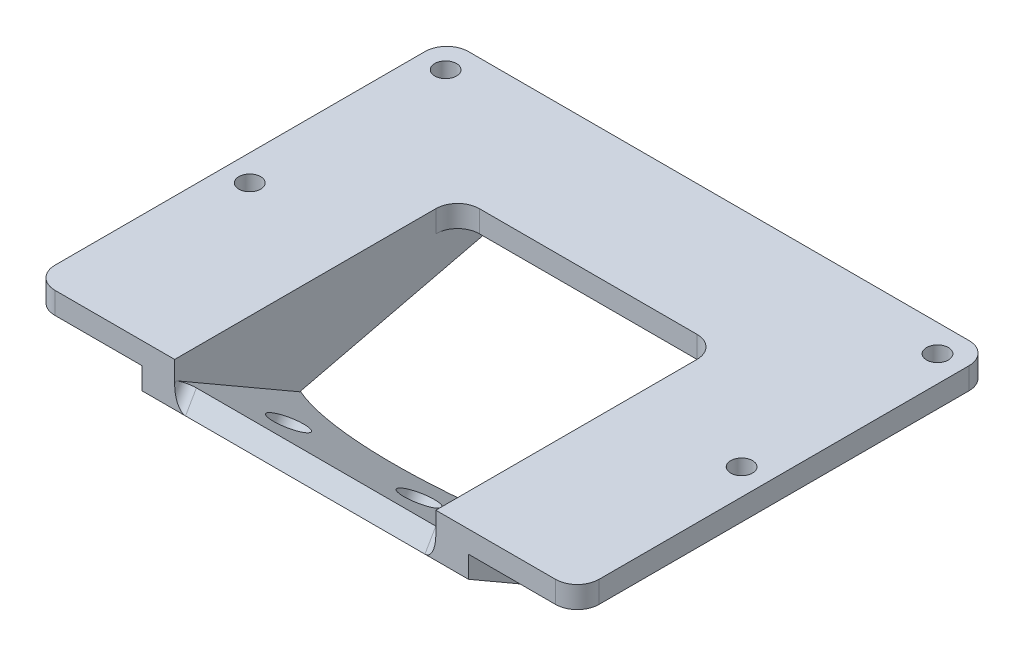
ISO-10303-21;
HEADER;
FILE_DESCRIPTION(('STEP AP214'),'2;1');
FILE_NAME('part.step','',(''),(''),'','','');
FILE_SCHEMA(('AUTOMOTIVE_DESIGN { 1 0 10303 214 1 1 1 1 }'));
ENDSEC;
DATA;
#1=APPLICATION_CONTEXT('core data for automotive mechanical design processes');
#2=APPLICATION_PROTOCOL_DEFINITION('international standard','automotive_design',2000,#1);
#3=PRODUCT_CONTEXT('',#1,'mechanical');
#4=PRODUCT('Part','Part','',(#3));
#5=PRODUCT_RELATED_PRODUCT_CATEGORY('part','',(#4));
#6=PRODUCT_DEFINITION_FORMATION('','',#4);
#7=PRODUCT_DEFINITION_CONTEXT('part definition',#1,'design');
#8=PRODUCT_DEFINITION('design','',#6,#7);
#9=PRODUCT_DEFINITION_SHAPE('','',#8);
#10=(LENGTH_UNIT() NAMED_UNIT(*) SI_UNIT(.MILLI.,.METRE.));
#11=(NAMED_UNIT(*) PLANE_ANGLE_UNIT() SI_UNIT($,.RADIAN.));
#12=(NAMED_UNIT(*) SI_UNIT($,.STERADIAN.) SOLID_ANGLE_UNIT());
#13=UNCERTAINTY_MEASURE_WITH_UNIT(LENGTH_MEASURE(1.E-05),#10,'distance_accuracy_value','');
#14=(GEOMETRIC_REPRESENTATION_CONTEXT(3) GLOBAL_UNCERTAINTY_ASSIGNED_CONTEXT((#13)) GLOBAL_UNIT_ASSIGNED_CONTEXT((#10,
#11,#12)) REPRESENTATION_CONTEXT('',''));
#15=CARTESIAN_POINT('',(0.,0.,0.));
#16=DIRECTION('',(0.,0.,1.));
#17=DIRECTION('',(1.,0.,0.));
#18=AXIS2_PLACEMENT_3D('',#15,#16,#17);
#19=CARTESIAN_POINT('',(15.,-7.00000000000001,10.3397459621556));
#20=DIRECTION('',(0.,0.972698943244275,0.232070605229251));
#21=DIRECTION('',(0.,-0.232070605229251,0.972698943244275));
#22=AXIS2_PLACEMENT_3D('',#19,#20,#21);
#23=PLANE('',#22);
#24=DIRECTION('',(1.,0.,0.));
#25=VECTOR('',#24,1.);
#26=CARTESIAN_POINT('',(15.,-6.32471707068706,7.50937030520959));
#27=LINE('',#26,#25);
#28=CARTESIAN_POINT('',(12.,-6.32471707068706,7.5093703052096));
#29=VERTEX_POINT('',#28);
#30=CARTESIAN_POINT('',(15.,-6.32471707068706,7.50937030520959));
#31=VERTEX_POINT('',#30);
#32=EDGE_CURVE('E207',#29,#31,#27,.T.);
#33=ORIENTED_EDGE('',*,*,#32,.F.);
#34=DIRECTION('',(0.,0.232070605229251,-0.972698943244275));
#35=VECTOR('',#34,1.);
#36=CARTESIAN_POINT('',(12.,-7.00000000000001,10.3397459621556));
#37=LINE('',#36,#35);
#38=CARTESIAN_POINT('',(12.,0.,-19.));
#39=VERTEX_POINT('',#38);
#40=EDGE_CURVE('E259',#29,#39,#37,.T.);
#41=ORIENTED_EDGE('',*,*,#40,.T.);
#42=DIRECTION('',(-1.,0.,0.));
#43=VECTOR('',#42,1.);
#44=CARTESIAN_POINT('',(15.,0.,-19.));
#45=LINE('',#44,#43);
#46=CARTESIAN_POINT('',(15.,0.,-19.));
#47=VERTEX_POINT('',#46);
#48=EDGE_CURVE('E257',#47,#39,#45,.T.);
#49=ORIENTED_EDGE('',*,*,#48,.F.);
#50=DIRECTION('',(0.,0.232070605229251,-0.972698943244275));
#51=VECTOR('',#50,1.);
#52=CARTESIAN_POINT('',(15.,-7.00000000000001,10.3397459621556));
#53=LINE('',#52,#51);
#54=EDGE_CURVE('E251',#31,#47,#53,.T.);
#55=ORIENTED_EDGE('',*,*,#54,.F.);
#56=EDGE_LOOP('',(#33,#41,#49,#55));
#57=FACE_BOUND('',#56,.T.);
#58=ADVANCED_FACE('F43',(#57),#23,.F.);
#59=CARTESIAN_POINT('',(-15.,-7.00000000000001,10.3397459621556));
#60=DIRECTION('',(0.,-0.972698943244275,-0.232070605229251));
#61=DIRECTION('',(0.,0.232070605229251,-0.972698943244275));
#62=AXIS2_PLACEMENT_3D('',#59,#60,#61);
#63=PLANE('',#62);
#64=DIRECTION('',(0.,0.232070605229251,-0.972698943244275));
#65=VECTOR('',#64,1.);
#66=CARTESIAN_POINT('',(-12.,-7.00000000000001,10.3397459621556));
#67=LINE('',#66,#65);
#68=CARTESIAN_POINT('',(-12.,-6.32471707068706,7.5093703052096));
#69=VERTEX_POINT('',#68);
#70=CARTESIAN_POINT('',(-12.,0.,-19.));
#71=VERTEX_POINT('',#70);
#72=EDGE_CURVE('E226',#69,#71,#67,.T.);
#73=ORIENTED_EDGE('',*,*,#72,.F.);
#74=DIRECTION('',(-1.,0.,0.));
#75=VECTOR('',#74,1.);
#76=CARTESIAN_POINT('',(-15.,-6.32471707068706,7.50937030520959));
#77=LINE('',#76,#75);
#78=CARTESIAN_POINT('',(-15.,-6.32471707068706,7.5093703052096));
#79=VERTEX_POINT('',#78);
#80=EDGE_CURVE('E200',#69,#79,#77,.T.);
#81=ORIENTED_EDGE('',*,*,#80,.T.);
#82=DIRECTION('',(0.,0.232070605229251,-0.972698943244275));
#83=VECTOR('',#82,1.);
#84=CARTESIAN_POINT('',(-15.,-7.00000000000001,10.3397459621556));
#85=LINE('',#84,#83);
#86=CARTESIAN_POINT('',(-15.,0.,-19.));
#87=VERTEX_POINT('',#86);
#88=EDGE_CURVE('E229',#79,#87,#85,.T.);
#89=ORIENTED_EDGE('',*,*,#88,.T.);
#90=DIRECTION('',(1.,0.,0.));
#91=VECTOR('',#90,1.);
#92=CARTESIAN_POINT('',(-15.,0.,-19.));
#93=LINE('',#92,#91);
#94=EDGE_CURVE('E242',#87,#71,#93,.T.);
#95=ORIENTED_EDGE('',*,*,#94,.T.);
#96=EDGE_LOOP('',(#73,#81,#89,#95));
#97=FACE_BOUND('',#96,.T.);
#98=ADVANCED_FACE('F491',(#97),#63,.T.);
#99=CARTESIAN_POINT('',(-25.,2.,19.));
#100=DIRECTION('',(0.,0.,-1.));
#101=DIRECTION('',(-1.,0.,0.));
#102=AXIS2_PLACEMENT_3D('',#99,#100,#101);
#103=PLANE('',#102);
#104=DIRECTION('',(1.,0.,0.));
#105=VECTOR('',#104,1.);
#106=CARTESIAN_POINT('',(-25.,2.,19.));
#107=LINE('',#106,#105);
#108=CARTESIAN_POINT('',(-23.,2.,19.));
#109=VERTEX_POINT('',#108);
#110=CARTESIAN_POINT('',(-12.,2.,19.));
#111=VERTEX_POINT('',#110);
#112=EDGE_CURVE('E303',#109,#111,#107,.T.);
#113=ORIENTED_EDGE('',*,*,#112,.F.);
#114=DIRECTION('',(0.,-1.,0.));
#115=VECTOR('',#114,1.);
#116=CARTESIAN_POINT('',(-23.,2.,19.));
#117=LINE('',#116,#115);
#118=CARTESIAN_POINT('',(-23.,0.,19.));
#119=VERTEX_POINT('',#118);
#120=EDGE_CURVE('E364',#109,#119,#117,.T.);
#121=ORIENTED_EDGE('',*,*,#120,.T.);
#122=DIRECTION('',(1.,0.,0.));
#123=VECTOR('',#122,1.);
#124=CARTESIAN_POINT('',(-25.,0.,19.));
#125=LINE('',#124,#123);
#126=CARTESIAN_POINT('',(-15.,0.,19.));
#127=VERTEX_POINT('',#126);
#128=EDGE_CURVE('E296',#119,#127,#125,.T.);
#129=ORIENTED_EDGE('',*,*,#128,.T.);
#130=DIRECTION('',(0.,-1.,0.));
#131=VECTOR('',#130,1.);
#132=CARTESIAN_POINT('',(-15.,0.,19.));
#133=LINE('',#132,#131);
#134=CARTESIAN_POINT('',(-15.,-2.,19.));
#135=VERTEX_POINT('',#134);
#136=EDGE_CURVE('E223',#127,#135,#133,.T.);
#137=ORIENTED_EDGE('',*,*,#136,.T.);
#138=DIRECTION('',(1.,0.,0.));
#139=VECTOR('',#138,1.);
#140=CARTESIAN_POINT('',(-15.,-2.,19.));
#141=LINE('',#140,#139);
#142=CARTESIAN_POINT('',(-11.,-2.,19.));
#143=VERTEX_POINT('',#142);
#144=EDGE_CURVE('E81',#135,#143,#141,.T.);
#145=ORIENTED_EDGE('',*,*,#144,.T.);
#146=CARTESIAN_POINT('',(-11.,0.,19.));
#147=DIRECTION('',(0.,0.,-1.));
#148=DIRECTION('',(0.,1.,0.));
#149=AXIS2_PLACEMENT_3D('',#146,#147,#148);
#150=ELLIPSE('',#149,2.,1.);
#151=CARTESIAN_POINT('',(-12.,0.,19.));
#152=VERTEX_POINT('',#151);
#153=EDGE_CURVE('E150',#143,#152,#150,.T.);
#154=ORIENTED_EDGE('',*,*,#153,.T.);
#155=DIRECTION('',(0.,-1.,0.));
#156=VECTOR('',#155,1.);
#157=CARTESIAN_POINT('',(-12.,0.,19.));
#158=LINE('',#157,#156);
#159=EDGE_CURVE('E222',#111,#152,#158,.T.);
#160=ORIENTED_EDGE('',*,*,#159,.F.);
#161=EDGE_LOOP('',(#113,#121,#129,#137,#145,#154,#160));
#162=FACE_BOUND('',#161,.T.);
#163=ADVANCED_FACE('F408',(#162),#103,.F.);
#164=CARTESIAN_POINT('',(0.,0.,0.));
#165=DIRECTION('',(0.,-1.,0.));
#166=DIRECTION('',(0.,0.,-1.));
#167=AXIS2_PLACEMENT_3D('',#164,#165,#166);
#168=PLANE('',#167);
#169=DIRECTION('',(1.,0.,0.));
#170=VECTOR('',#169,1.);
#171=CARTESIAN_POINT('',(0.,0.,-7.));
#172=LINE('',#171,#170);
#173=CARTESIAN_POINT('',(-10.,0.,-7.));
#174=VERTEX_POINT('',#173);
#175=CARTESIAN_POINT('',(10.,0.,-7.));
#176=VERTEX_POINT('',#175);
#177=EDGE_CURVE('E219',#174,#176,#172,.T.);
#178=ORIENTED_EDGE('',*,*,#177,.F.);
#179=CARTESIAN_POINT('',(-10.,0.,-5.));
#180=DIRECTION('',(0.,-1.,0.));
#181=DIRECTION('',(0.,0.,-1.));
#182=AXIS2_PLACEMENT_3D('',#179,#180,#181);
#183=CIRCLE('',#182,2.);
#184=CARTESIAN_POINT('',(-12.,0.,-5.));
#185=VERTEX_POINT('',#184);
#186=EDGE_CURVE('E382',#174,#185,#183,.F.);
#187=ORIENTED_EDGE('',*,*,#186,.T.);
#188=DIRECTION('',(0.,0.,1.));
#189=VECTOR('',#188,1.);
#190=CARTESIAN_POINT('',(-12.,0.,19.));
#191=LINE('',#190,#189);
#192=EDGE_CURVE('E236',#71,#185,#191,.T.);
#193=ORIENTED_EDGE('',*,*,#192,.F.);
#194=DIRECTION('',(-1.,0.,0.));
#195=VECTOR('',#194,1.);
#196=CARTESIAN_POINT('',(-25.,0.,-19.));
#197=LINE('',#196,#195);
#198=EDGE_CURVE('E314',#39,#71,#197,.T.);
#199=ORIENTED_EDGE('',*,*,#198,.F.);
#200=DIRECTION('',(0.,0.,1.));
#201=VECTOR('',#200,1.);
#202=CARTESIAN_POINT('',(12.,0.,19.));
#203=LINE('',#202,#201);
#204=CARTESIAN_POINT('',(12.,0.,-5.));
#205=VERTEX_POINT('',#204);
#206=EDGE_CURVE('E249',#39,#205,#203,.T.);
#207=ORIENTED_EDGE('',*,*,#206,.T.);
#208=CARTESIAN_POINT('',(10.,0.,-5.));
#209=DIRECTION('',(0.,-1.,0.));
#210=DIRECTION('',(0.,0.,-1.));
#211=AXIS2_PLACEMENT_3D('',#208,#209,#210);
#212=CIRCLE('',#211,2.);
#213=EDGE_CURVE('E388',#205,#176,#212,.F.);
#214=ORIENTED_EDGE('',*,*,#213,.T.);
#215=EDGE_LOOP('',(#178,#187,#193,#199,#207,#214));
#216=FACE_BOUND('',#215,.T.);
#217=ADVANCED_FACE('F514',(#216),#168,.T.);
#218=DIRECTION('',(0.,0.,1.));
#219=VECTOR('',#218,1.);
#220=CARTESIAN_POINT('',(-25.,0.,19.));
#221=LINE('',#220,#219);
#222=CARTESIAN_POINT('',(-25.,0.,-17.));
#223=VERTEX_POINT('',#222);
#224=CARTESIAN_POINT('',(-25.,0.,17.));
#225=VERTEX_POINT('',#224);
#226=EDGE_CURVE('E313',#223,#225,#221,.T.);
#227=ORIENTED_EDGE('',*,*,#226,.F.);
#228=CARTESIAN_POINT('',(-23.,0.,-17.));
#229=DIRECTION('',(0.,-1.,0.));
#230=DIRECTION('',(0.,0.,-1.));
#231=AXIS2_PLACEMENT_3D('',#228,#229,#230);
#232=CIRCLE('',#231,2.);
#233=CARTESIAN_POINT('',(-23.,0.,-19.));
#234=VERTEX_POINT('',#233);
#235=EDGE_CURVE('E361',#223,#234,#232,.T.);
#236=ORIENTED_EDGE('',*,*,#235,.T.);
#237=EDGE_CURVE('E309',#87,#234,#197,.T.);
#238=ORIENTED_EDGE('',*,*,#237,.F.);
#239=DIRECTION('',(0.,0.,1.));
#240=VECTOR('',#239,1.);
#241=CARTESIAN_POINT('',(-15.,0.,19.));
#242=LINE('',#241,#240);
#243=EDGE_CURVE('E225',#87,#127,#242,.T.);
#244=ORIENTED_EDGE('',*,*,#243,.T.);
#245=ORIENTED_EDGE('',*,*,#128,.F.);
#246=CARTESIAN_POINT('',(-23.,0.,17.));
#247=DIRECTION('',(0.,-1.,0.));
#248=DIRECTION('',(0.,0.,-1.));
#249=AXIS2_PLACEMENT_3D('',#246,#247,#248);
#250=CIRCLE('',#249,2.);
#251=EDGE_CURVE('E358',#119,#225,#250,.T.);
#252=ORIENTED_EDGE('',*,*,#251,.T.);
#253=EDGE_LOOP('',(#227,#236,#238,#244,#245,#252));
#254=FACE_BOUND('',#253,.T.);
#255=CARTESIAN_POINT('',(-22.6,0.,1.49999999999999));
#256=DIRECTION('',(0.,1.,0.));
#257=DIRECTION('',(0.,0.,1.));
#258=AXIS2_PLACEMENT_3D('',#255,#256,#257);
#259=CIRCLE('',#258,1.);
#260=CARTESIAN_POINT('',(-22.6,0.,2.5));
#261=VERTEX_POINT('',#260);
#262=EDGE_CURVE('E277',#261,#261,#259,.T.);
#263=ORIENTED_EDGE('',*,*,#262,.T.);
#264=EDGE_LOOP('',(#263));
#265=FACE_BOUND('',#264,.T.);
#266=CARTESIAN_POINT('',(-22.6,0.,-16.5));
#267=DIRECTION('',(0.,1.,0.));
#268=DIRECTION('',(0.,0.,1.));
#269=AXIS2_PLACEMENT_3D('',#266,#267,#268);
#270=CIRCLE('',#269,1.);
#271=CARTESIAN_POINT('',(-22.6,0.,-15.5));
#272=VERTEX_POINT('',#271);
#273=EDGE_CURVE('E283',#272,#272,#270,.T.);
#274=ORIENTED_EDGE('',*,*,#273,.T.);
#275=EDGE_LOOP('',(#274));
#276=FACE_BOUND('',#275,.T.);
#277=ADVANCED_FACE('F503',(#254,#265,#276),#168,.T.);
#278=CARTESIAN_POINT('',(0.,2.,0.));
#279=DIRECTION('',(0.,-1.,0.));
#280=DIRECTION('',(0.,0.,-1.));
#281=AXIS2_PLACEMENT_3D('',#278,#279,#280);
#282=PLANE('',#281);
#283=CARTESIAN_POINT('',(12.,2.,19.));
#284=VERTEX_POINT('',#283);
#285=CARTESIAN_POINT('',(23.,2.,19.));
#286=VERTEX_POINT('',#285);
#287=EDGE_CURVE('E302',#284,#286,#107,.T.);
#288=ORIENTED_EDGE('',*,*,#287,.T.);
#289=CARTESIAN_POINT('',(23.,2.,17.));
#290=DIRECTION('',(0.,-1.,0.));
#291=DIRECTION('',(0.,0.,-1.));
#292=AXIS2_PLACEMENT_3D('',#289,#290,#291);
#293=CIRCLE('',#292,2.);
#294=CARTESIAN_POINT('',(25.,2.,17.));
#295=VERTEX_POINT('',#294);
#296=EDGE_CURVE('E343',#286,#295,#293,.F.);
#297=ORIENTED_EDGE('',*,*,#296,.T.);
#298=DIRECTION('',(0.,0.,-1.));
#299=VECTOR('',#298,1.);
#300=CARTESIAN_POINT('',(25.,2.,19.));
#301=LINE('',#300,#299);
#302=CARTESIAN_POINT('',(25.,2.,-17.));
#303=VERTEX_POINT('',#302);
#304=EDGE_CURVE('E292',#295,#303,#301,.T.);
#305=ORIENTED_EDGE('',*,*,#304,.T.);
#306=CARTESIAN_POINT('',(23.,2.,-17.));
#307=DIRECTION('',(0.,-1.,0.));
#308=DIRECTION('',(0.,0.,-1.));
#309=AXIS2_PLACEMENT_3D('',#306,#307,#308);
#310=CIRCLE('',#309,2.);
#311=CARTESIAN_POINT('',(23.,2.,-19.));
#312=VERTEX_POINT('',#311);
#313=EDGE_CURVE('E340',#303,#312,#310,.F.);
#314=ORIENTED_EDGE('',*,*,#313,.T.);
#315=DIRECTION('',(-1.,0.,0.));
#316=VECTOR('',#315,1.);
#317=CARTESIAN_POINT('',(-25.,2.,-19.));
#318=LINE('',#317,#316);
#319=CARTESIAN_POINT('',(-23.,2.,-19.));
#320=VERTEX_POINT('',#319);
#321=EDGE_CURVE('E295',#312,#320,#318,.T.);
#322=ORIENTED_EDGE('',*,*,#321,.T.);
#323=CARTESIAN_POINT('',(-23.,2.,-17.));
#324=DIRECTION('',(0.,-1.,0.));
#325=DIRECTION('',(0.,0.,-1.));
#326=AXIS2_PLACEMENT_3D('',#323,#324,#325);
#327=CIRCLE('',#326,2.);
#328=CARTESIAN_POINT('',(-25.,2.,-17.));
#329=VERTEX_POINT('',#328);
#330=EDGE_CURVE('E337',#320,#329,#327,.F.);
#331=ORIENTED_EDGE('',*,*,#330,.T.);
#332=DIRECTION('',(0.,0.,1.));
#333=VECTOR('',#332,1.);
#334=CARTESIAN_POINT('',(-25.,2.,19.));
#335=LINE('',#334,#333);
#336=CARTESIAN_POINT('',(-25.,2.,17.));
#337=VERTEX_POINT('',#336);
#338=EDGE_CURVE('E299',#329,#337,#335,.T.);
#339=ORIENTED_EDGE('',*,*,#338,.T.);
#340=CARTESIAN_POINT('',(-23.,2.,17.));
#341=DIRECTION('',(0.,-1.,0.));
#342=DIRECTION('',(0.,0.,-1.));
#343=AXIS2_PLACEMENT_3D('',#340,#341,#342);
#344=CIRCLE('',#343,2.);
#345=EDGE_CURVE('E334',#337,#109,#344,.F.);
#346=ORIENTED_EDGE('',*,*,#345,.T.);
#347=ORIENTED_EDGE('',*,*,#112,.T.);
#348=DIRECTION('',(0.,0.,1.));
#349=VECTOR('',#348,1.);
#350=CARTESIAN_POINT('',(-12.,2.,19.));
#351=LINE('',#350,#349);
#352=CARTESIAN_POINT('',(-12.,2.,-5.));
#353=VERTEX_POINT('',#352);
#354=EDGE_CURVE('E210',#353,#111,#351,.T.);
#355=ORIENTED_EDGE('',*,*,#354,.F.);
#356=CARTESIAN_POINT('',(-10.,2.,-5.));
#357=DIRECTION('',(0.,-1.,0.));
#358=DIRECTION('',(0.,0.,-1.));
#359=AXIS2_PLACEMENT_3D('',#356,#357,#358);
#360=CIRCLE('',#359,2.);
#361=CARTESIAN_POINT('',(-10.,2.,-7.));
#362=VERTEX_POINT('',#361);
#363=EDGE_CURVE('E379',#353,#362,#360,.T.);
#364=ORIENTED_EDGE('',*,*,#363,.T.);
#365=DIRECTION('',(-1.,0.,0.));
#366=VECTOR('',#365,1.);
#367=CARTESIAN_POINT('',(-12.,2.,-7.));
#368=LINE('',#367,#366);
#369=CARTESIAN_POINT('',(10.,2.,-7.));
#370=VERTEX_POINT('',#369);
#371=EDGE_CURVE('E216',#370,#362,#368,.T.);
#372=ORIENTED_EDGE('',*,*,#371,.F.);
#373=CARTESIAN_POINT('',(10.,2.,-5.));
#374=DIRECTION('',(0.,-1.,0.));
#375=DIRECTION('',(0.,0.,-1.));
#376=AXIS2_PLACEMENT_3D('',#373,#374,#375);
#377=CIRCLE('',#376,2.);
#378=CARTESIAN_POINT('',(12.,2.,-5.));
#379=VERTEX_POINT('',#378);
#380=EDGE_CURVE('E385',#370,#379,#377,.T.);
#381=ORIENTED_EDGE('',*,*,#380,.T.);
#382=DIRECTION('',(0.,0.,-1.));
#383=VECTOR('',#382,1.);
#384=CARTESIAN_POINT('',(12.,2.,19.));
#385=LINE('',#384,#383);
#386=EDGE_CURVE('E213',#284,#379,#385,.T.);
#387=ORIENTED_EDGE('',*,*,#386,.F.);
#388=EDGE_LOOP('',(#288,#297,#305,#314,#322,#331,#339,#346,#347,#355,#364,#372,#381,#387));
#389=FACE_BOUND('',#388,.T.);
#390=CARTESIAN_POINT('',(-22.6,2.,-16.5));
#391=DIRECTION('',(0.,1.,0.));
#392=DIRECTION('',(0.,0.,1.));
#393=AXIS2_PLACEMENT_3D('',#390,#391,#392);
#394=CIRCLE('',#393,1.);
#395=CARTESIAN_POINT('',(-22.6,2.,-15.5));
#396=VERTEX_POINT('',#395);
#397=EDGE_CURVE('E286',#396,#396,#394,.T.);
#398=ORIENTED_EDGE('',*,*,#397,.F.);
#399=EDGE_LOOP('',(#398));
#400=FACE_BOUND('',#399,.T.);
#401=CARTESIAN_POINT('',(-22.6,2.,1.49999999999999));
#402=DIRECTION('',(0.,1.,0.));
#403=DIRECTION('',(0.,0.,1.));
#404=AXIS2_PLACEMENT_3D('',#401,#402,#403);
#405=CIRCLE('',#404,1.);
#406=CARTESIAN_POINT('',(-22.6,2.,2.5));
#407=VERTEX_POINT('',#406);
#408=EDGE_CURVE('E280',#407,#407,#405,.T.);
#409=ORIENTED_EDGE('',*,*,#408,.F.);
#410=EDGE_LOOP('',(#409));
#411=FACE_BOUND('',#410,.T.);
#412=CARTESIAN_POINT('',(22.6,2.,-16.5));
#413=DIRECTION('',(0.,1.,0.));
#414=DIRECTION('',(0.,0.,1.));
#415=AXIS2_PLACEMENT_3D('',#412,#413,#414);
#416=CIRCLE('',#415,1.);
#417=CARTESIAN_POINT('',(22.6,2.,-15.5));
#418=VERTEX_POINT('',#417);
#419=EDGE_CURVE('E274',#418,#418,#416,.T.);
#420=ORIENTED_EDGE('',*,*,#419,.F.);
#421=EDGE_LOOP('',(#420));
#422=FACE_BOUND('',#421,.T.);
#423=CARTESIAN_POINT('',(22.6,2.,1.49999999999999));
#424=DIRECTION('',(0.,1.,0.));
#425=DIRECTION('',(0.,0.,1.));
#426=AXIS2_PLACEMENT_3D('',#423,#424,#425);
#427=CIRCLE('',#426,1.);
#428=CARTESIAN_POINT('',(22.6,2.,2.5));
#429=VERTEX_POINT('',#428);
#430=EDGE_CURVE('E268',#429,#429,#427,.T.);
#431=ORIENTED_EDGE('',*,*,#430,.F.);
#432=EDGE_LOOP('',(#431));
#433=FACE_BOUND('',#432,.T.);
#434=ADVANCED_FACE('F520',(#389,#400,#411,#422,#433),#282,.F.);
#435=DIRECTION('',(0.,0.,-1.));
#436=VECTOR('',#435,1.);
#437=CARTESIAN_POINT('',(25.,0.,19.));
#438=LINE('',#437,#436);
#439=CARTESIAN_POINT('',(25.,0.,17.));
#440=VERTEX_POINT('',#439);
#441=CARTESIAN_POINT('',(25.,0.,-17.));
#442=VERTEX_POINT('',#441);
#443=EDGE_CURVE('E289',#440,#442,#438,.T.);
#444=ORIENTED_EDGE('',*,*,#443,.F.);
#445=CARTESIAN_POINT('',(23.,0.,17.));
#446=DIRECTION('',(0.,-1.,0.));
#447=DIRECTION('',(0.,0.,-1.));
#448=AXIS2_PLACEMENT_3D('',#445,#446,#447);
#449=CIRCLE('',#448,2.);
#450=CARTESIAN_POINT('',(23.,0.,19.));
#451=VERTEX_POINT('',#450);
#452=EDGE_CURVE('E328',#440,#451,#449,.T.);
#453=ORIENTED_EDGE('',*,*,#452,.T.);
#454=CARTESIAN_POINT('',(15.,0.,19.));
#455=VERTEX_POINT('',#454);
#456=EDGE_CURVE('E317',#455,#451,#125,.T.);
#457=ORIENTED_EDGE('',*,*,#456,.F.);
#458=DIRECTION('',(0.,0.,1.));
#459=VECTOR('',#458,1.);
#460=CARTESIAN_POINT('',(15.,0.,19.));
#461=LINE('',#460,#459);
#462=EDGE_CURVE('E254',#47,#455,#461,.T.);
#463=ORIENTED_EDGE('',*,*,#462,.F.);
#464=CARTESIAN_POINT('',(23.,0.,-19.));
#465=VERTEX_POINT('',#464);
#466=EDGE_CURVE('E310',#465,#47,#197,.T.);
#467=ORIENTED_EDGE('',*,*,#466,.F.);
#468=CARTESIAN_POINT('',(23.,0.,-17.));
#469=DIRECTION('',(0.,-1.,0.));
#470=DIRECTION('',(0.,0.,-1.));
#471=AXIS2_PLACEMENT_3D('',#468,#469,#470);
#472=CIRCLE('',#471,2.);
#473=EDGE_CURVE('E325',#465,#442,#472,.T.);
#474=ORIENTED_EDGE('',*,*,#473,.T.);
#475=EDGE_LOOP('',(#444,#453,#457,#463,#467,#474));
#476=FACE_BOUND('',#475,.T.);
#477=CARTESIAN_POINT('',(22.6,0.,-16.5));
#478=DIRECTION('',(0.,1.,0.));
#479=DIRECTION('',(0.,0.,1.));
#480=AXIS2_PLACEMENT_3D('',#477,#478,#479);
#481=CIRCLE('',#480,1.);
#482=CARTESIAN_POINT('',(22.6,0.,-15.5));
#483=VERTEX_POINT('',#482);
#484=EDGE_CURVE('E271',#483,#483,#481,.T.);
#485=ORIENTED_EDGE('',*,*,#484,.T.);
#486=EDGE_LOOP('',(#485));
#487=FACE_BOUND('',#486,.T.);
#488=CARTESIAN_POINT('',(22.6,0.,1.49999999999999));
#489=DIRECTION('',(0.,1.,0.));
#490=DIRECTION('',(0.,0.,1.));
#491=AXIS2_PLACEMENT_3D('',#488,#489,#490);
#492=CIRCLE('',#491,1.);
#493=CARTESIAN_POINT('',(22.6,0.,2.5));
#494=VERTEX_POINT('',#493);
#495=EDGE_CURVE('E267',#494,#494,#492,.T.);
#496=ORIENTED_EDGE('',*,*,#495,.T.);
#497=EDGE_LOOP('',(#496));
#498=FACE_BOUND('',#497,.T.);
#499=ADVANCED_FACE('F544',(#476,#487,#498),#168,.T.);
#500=CARTESIAN_POINT('',(25.,2.,19.));
#501=DIRECTION('',(-1.,0.,0.));
#502=DIRECTION('',(0.,0.,1.));
#503=AXIS2_PLACEMENT_3D('',#500,#501,#502);
#504=PLANE('',#503);
#505=ORIENTED_EDGE('',*,*,#304,.F.);
#506=DIRECTION('',(0.,-1.,0.));
#507=VECTOR('',#506,1.);
#508=CARTESIAN_POINT('',(25.,2.,17.));
#509=LINE('',#508,#507);
#510=EDGE_CURVE('E322',#295,#440,#509,.T.);
#511=ORIENTED_EDGE('',*,*,#510,.T.);
#512=ORIENTED_EDGE('',*,*,#443,.T.);
#513=DIRECTION('',(0.,-1.,0.));
#514=VECTOR('',#513,1.);
#515=CARTESIAN_POINT('',(25.,2.,-17.));
#516=LINE('',#515,#514);
#517=EDGE_CURVE('E306',#442,#303,#516,.F.);
#518=ORIENTED_EDGE('',*,*,#517,.T.);
#519=EDGE_LOOP('',(#505,#511,#512,#518));
#520=FACE_BOUND('',#519,.T.);
#521=ADVANCED_FACE('F608',(#520),#504,.F.);
#522=CARTESIAN_POINT('',(-25.,2.,-19.));
#523=DIRECTION('',(0.,0.,1.));
#524=DIRECTION('',(1.,0.,0.));
#525=AXIS2_PLACEMENT_3D('',#522,#523,#524);
#526=PLANE('',#525);
#527=ORIENTED_EDGE('',*,*,#321,.F.);
#528=DIRECTION('',(0.,-1.,0.));
#529=VECTOR('',#528,1.);
#530=CARTESIAN_POINT('',(23.,2.,-19.));
#531=LINE('',#530,#529);
#532=EDGE_CURVE('E349',#312,#465,#531,.T.);
#533=ORIENTED_EDGE('',*,*,#532,.T.);
#534=ORIENTED_EDGE('',*,*,#466,.T.);
#535=ORIENTED_EDGE('',*,*,#48,.T.);
#536=ORIENTED_EDGE('',*,*,#198,.T.);
#537=ORIENTED_EDGE('',*,*,#94,.F.);
#538=ORIENTED_EDGE('',*,*,#237,.T.);
#539=DIRECTION('',(0.,-1.,0.));
#540=VECTOR('',#539,1.);
#541=CARTESIAN_POINT('',(-23.,2.,-19.));
#542=LINE('',#541,#540);
#543=EDGE_CURVE('E346',#234,#320,#542,.F.);
#544=ORIENTED_EDGE('',*,*,#543,.T.);
#545=EDGE_LOOP('',(#527,#533,#534,#535,#536,#537,#538,#544));
#546=FACE_BOUND('',#545,.T.);
#547=ADVANCED_FACE('F509',(#546),#526,.F.);
#548=CARTESIAN_POINT('',(-25.,2.,19.));
#549=DIRECTION('',(1.,0.,0.));
#550=DIRECTION('',(0.,0.,-1.));
#551=AXIS2_PLACEMENT_3D('',#548,#549,#550);
#552=PLANE('',#551);
#553=ORIENTED_EDGE('',*,*,#338,.F.);
#554=DIRECTION('',(0.,-1.,0.));
#555=VECTOR('',#554,1.);
#556=CARTESIAN_POINT('',(-25.,2.,-17.));
#557=LINE('',#556,#555);
#558=EDGE_CURVE('E355',#329,#223,#557,.T.);
#559=ORIENTED_EDGE('',*,*,#558,.T.);
#560=ORIENTED_EDGE('',*,*,#226,.T.);
#561=DIRECTION('',(0.,-1.,0.));
#562=VECTOR('',#561,1.);
#563=CARTESIAN_POINT('',(-25.,2.,17.));
#564=LINE('',#563,#562);
#565=EDGE_CURVE('E352',#225,#337,#564,.F.);
#566=ORIENTED_EDGE('',*,*,#565,.T.);
#567=EDGE_LOOP('',(#553,#559,#560,#566));
#568=FACE_BOUND('',#567,.T.);
#569=ADVANCED_FACE('F529',(#568),#552,.F.);
#570=ORIENTED_EDGE('',*,*,#456,.T.);
#571=DIRECTION('',(0.,-1.,0.));
#572=VECTOR('',#571,1.);
#573=CARTESIAN_POINT('',(23.,2.,19.));
#574=LINE('',#573,#572);
#575=EDGE_CURVE('E331',#451,#286,#574,.F.);
#576=ORIENTED_EDGE('',*,*,#575,.T.);
#577=ORIENTED_EDGE('',*,*,#287,.F.);
#578=DIRECTION('',(0.,-1.,0.));
#579=VECTOR('',#578,1.);
#580=CARTESIAN_POINT('',(12.,0.,19.));
#581=LINE('',#580,#579);
#582=CARTESIAN_POINT('',(12.,0.,19.));
#583=VERTEX_POINT('',#582);
#584=EDGE_CURVE('E161',#284,#583,#581,.T.);
#585=ORIENTED_EDGE('',*,*,#584,.T.);
#586=CARTESIAN_POINT('',(11.,0.,19.));
#587=DIRECTION('',(0.,0.,-1.));
#588=DIRECTION('',(0.,-1.,0.));
#589=AXIS2_PLACEMENT_3D('',#586,#587,#588);
#590=ELLIPSE('',#589,2.,1.);
#591=CARTESIAN_POINT('',(11.,-2.,19.));
#592=VERTEX_POINT('',#591);
#593=EDGE_CURVE('E51',#583,#592,#590,.T.);
#594=ORIENTED_EDGE('',*,*,#593,.T.);
#595=DIRECTION('',(-1.,0.,0.));
#596=VECTOR('',#595,1.);
#597=CARTESIAN_POINT('',(15.,-2.,19.));
#598=LINE('',#597,#596);
#599=CARTESIAN_POINT('',(15.,-2.,19.));
#600=VERTEX_POINT('',#599);
#601=EDGE_CURVE('E58',#600,#592,#598,.T.);
#602=ORIENTED_EDGE('',*,*,#601,.F.);
#603=DIRECTION('',(0.,-1.,0.));
#604=VECTOR('',#603,1.);
#605=CARTESIAN_POINT('',(15.,0.,19.));
#606=LINE('',#605,#604);
#607=EDGE_CURVE('E245',#455,#600,#606,.T.);
#608=ORIENTED_EDGE('',*,*,#607,.F.);
#609=EDGE_LOOP('',(#570,#576,#577,#585,#594,#602,#608));
#610=FACE_BOUND('',#609,.T.);
#611=ADVANCED_FACE('F156',(#610),#103,.F.);
#612=CARTESIAN_POINT('',(-22.6,2.,-16.5));
#613=DIRECTION('',(0.,-1.,0.));
#614=DIRECTION('',(0.,0.,-1.));
#615=AXIS2_PLACEMENT_3D('',#612,#613,#614);
#616=CYLINDRICAL_SURFACE('',#615,1.);
#617=ORIENTED_EDGE('',*,*,#397,.T.);
#618=EDGE_LOOP('',(#617));
#619=FACE_BOUND('',#618,.T.);
#620=ORIENTED_EDGE('',*,*,#273,.F.);
#621=EDGE_LOOP('',(#620));
#622=FACE_BOUND('',#621,.T.);
#623=ADVANCED_FACE('F599',(#619,#622),#616,.F.);
#624=CARTESIAN_POINT('',(-22.6,2.,1.49999999999999));
#625=DIRECTION('',(0.,-1.,0.));
#626=DIRECTION('',(0.,0.,-1.));
#627=AXIS2_PLACEMENT_3D('',#624,#625,#626);
#628=CYLINDRICAL_SURFACE('',#627,1.);
#629=ORIENTED_EDGE('',*,*,#408,.T.);
#630=EDGE_LOOP('',(#629));
#631=FACE_BOUND('',#630,.T.);
#632=ORIENTED_EDGE('',*,*,#262,.F.);
#633=EDGE_LOOP('',(#632));
#634=FACE_BOUND('',#633,.T.);
#635=ADVANCED_FACE('F595',(#631,#634),#628,.F.);
#636=CARTESIAN_POINT('',(22.6,2.,-16.5));
#637=DIRECTION('',(0.,-1.,0.));
#638=DIRECTION('',(0.,0.,-1.));
#639=AXIS2_PLACEMENT_3D('',#636,#637,#638);
#640=CYLINDRICAL_SURFACE('',#639,1.);
#641=ORIENTED_EDGE('',*,*,#419,.T.);
#642=EDGE_LOOP('',(#641));
#643=FACE_BOUND('',#642,.T.);
#644=ORIENTED_EDGE('',*,*,#484,.F.);
#645=EDGE_LOOP('',(#644));
#646=FACE_BOUND('',#645,.T.);
#647=ADVANCED_FACE('F591',(#643,#646),#640,.F.);
#648=CARTESIAN_POINT('',(22.6,2.,1.49999999999999));
#649=DIRECTION('',(0.,-1.,0.));
#650=DIRECTION('',(0.,0.,-1.));
#651=AXIS2_PLACEMENT_3D('',#648,#649,#650);
#652=CYLINDRICAL_SURFACE('',#651,1.);
#653=ORIENTED_EDGE('',*,*,#430,.T.);
#654=EDGE_LOOP('',(#653));
#655=FACE_BOUND('',#654,.T.);
#656=ORIENTED_EDGE('',*,*,#495,.F.);
#657=EDGE_LOOP('',(#656));
#658=FACE_BOUND('',#657,.T.);
#659=ADVANCED_FACE('F587',(#655,#658),#652,.F.);
#660=CARTESIAN_POINT('',(15.,-2.,19.));
#661=DIRECTION('',(0.,0.866025403784438,-0.500000000000001));
#662=DIRECTION('',(0.,0.500000000000001,0.866025403784438));
#663=AXIS2_PLACEMENT_3D('',#660,#661,#662);
#664=PLANE('',#663);
#665=CARTESIAN_POINT('',(-6.,-4.00000000000001,15.5358983848622));
#666=DIRECTION('',(0.,0.866025403784438,-0.500000000000001));
#667=DIRECTION('',(0.,0.500000000000001,0.866025403784438));
#668=AXIS2_PLACEMENT_3D('',#665,#666,#667);
#669=CIRCLE('',#668,1.6);
#670=CARTESIAN_POINT('',(-6.,-3.2,16.9215390309173));
#671=VERTEX_POINT('',#670);
#672=EDGE_CURVE('E139',#671,#671,#669,.F.);
#673=ORIENTED_EDGE('',*,*,#672,.F.);
#674=EDGE_LOOP('',(#673));
#675=FACE_BOUND('',#674,.T.);
#676=CARTESIAN_POINT('',(6.,-4.00000000000001,15.5358983848622));
#677=DIRECTION('',(0.,0.866025403784438,-0.500000000000001));
#678=DIRECTION('',(0.,0.500000000000001,0.866025403784438));
#679=AXIS2_PLACEMENT_3D('',#676,#677,#678);
#680=CIRCLE('',#679,1.6);
#681=CARTESIAN_POINT('',(6.,-3.2,16.9215390309173));
#682=VERTEX_POINT('',#681);
#683=EDGE_CURVE('E977',#682,#682,#680,.F.);
#684=ORIENTED_EDGE('',*,*,#683,.F.);
#685=EDGE_LOOP('',(#684));
#686=FACE_BOUND('',#685,.T.);
#687=DIRECTION('',(0.,-0.500000000000001,-0.866025403784438));
#688=VECTOR('',#687,1.);
#689=CARTESIAN_POINT('',(-15.,-2.,19.));
#690=LINE('',#689,#688);
#691=CARTESIAN_POINT('',(-15.,-8.28814035641223,8.10862141756978));
#692=VERTEX_POINT('',#691);
#693=EDGE_CURVE('E232',#135,#692,#690,.T.);
#694=ORIENTED_EDGE('',*,*,#693,.T.);
#695=CARTESIAN_POINT('',(-14.,-8.28814035641222,8.10862141756978));
#696=DIRECTION('',(0.,0.866025403784438,-0.500000000000001));
#697=DIRECTION('',(0.,0.500000000000001,0.866025403784438));
#698=AXIS2_PLACEMENT_3D('',#695,#696,#697);
#699=CIRCLE('',#698,1.);
#700=CARTESIAN_POINT('',(-13.3333333333333,-8.66081835266219,7.46312419320188));
#701=VERTEX_POINT('',#700);
#702=EDGE_CURVE('E183',#692,#701,#699,.F.);
#703=ORIENTED_EDGE('',*,*,#702,.T.);
#704=CARTESIAN_POINT('',(0.,-16.1143782776615,-5.44682029415617));
#705=DIRECTION('',(0.,-0.866025403784438,0.500000000000001));
#706=DIRECTION('',(0.,0.500000000000001,0.866025403784438));
#707=AXIS2_PLACEMENT_3D('',#704,#705,#706);
#708=CIRCLE('',#707,20.);
#709=CARTESIAN_POINT('',(13.3333333333333,-8.66081835266219,7.46312419320188));
#710=VERTEX_POINT('',#709);
#711=EDGE_CURVE('E128',#710,#701,#708,.T.);
#712=ORIENTED_EDGE('',*,*,#711,.F.);
#713=CARTESIAN_POINT('',(14.,-8.28814035641222,8.10862141756978));
#714=DIRECTION('',(0.,0.866025403784438,-0.500000000000001));
#715=DIRECTION('',(0.,0.500000000000001,0.866025403784438));
#716=AXIS2_PLACEMENT_3D('',#713,#714,#715);
#717=CIRCLE('',#716,1.);
#718=CARTESIAN_POINT('',(15.,-8.28814035641223,8.10862141756978));
#719=VERTEX_POINT('',#718);
#720=EDGE_CURVE('E181',#710,#719,#717,.F.);
#721=ORIENTED_EDGE('',*,*,#720,.T.);
#722=DIRECTION('',(0.,-0.500000000000001,-0.866025403784438));
#723=VECTOR('',#722,1.);
#724=CARTESIAN_POINT('',(15.,-2.,19.));
#725=LINE('',#724,#723);
#726=EDGE_CURVE('E248',#600,#719,#725,.T.);
#727=ORIENTED_EDGE('',*,*,#726,.F.);
#728=ORIENTED_EDGE('',*,*,#601,.T.);
#729=DIRECTION('',(-1.,0.,0.));
#730=VECTOR('',#729,1.);
#731=CARTESIAN_POINT('',(-15.,-2.,19.));
#732=LINE('',#731,#730);
#733=EDGE_CURVE('E188',#592,#143,#732,.T.);
#734=ORIENTED_EDGE('',*,*,#733,.T.);
#735=ORIENTED_EDGE('',*,*,#144,.F.);
#736=EDGE_LOOP('',(#694,#703,#712,#721,#727,#728,#734,#735));
#737=FACE_BOUND('',#736,.T.);
#738=ADVANCED_FACE('F187',(#675,#686,#737),#664,.F.);
#739=CARTESIAN_POINT('',(15.,0.,0.));
#740=DIRECTION('',(1.,0.,0.));
#741=DIRECTION('',(0.,0.,-1.));
#742=AXIS2_PLACEMENT_3D('',#739,#740,#741);
#743=PLANE('',#742);
#744=ORIENTED_EDGE('',*,*,#726,.T.);
#745=DIRECTION('',(0.,0.866025403784438,-0.500000000000001));
#746=VECTOR('',#745,1.);
#747=CARTESIAN_POINT('',(15.,-6.55608954884336,7.10862141756978));
#748=LINE('',#747,#746);
#749=CARTESIAN_POINT('',(15.,-6.55608954884335,7.10862141756978));
#750=VERTEX_POINT('',#749);
#751=EDGE_CURVE('E67',#719,#750,#748,.T.);
#752=ORIENTED_EDGE('',*,*,#751,.T.);
#753=DIRECTION('',(0.,0.500000000000001,0.866025403784438));
#754=VECTOR('',#753,1.);
#755=CARTESIAN_POINT('',(15.,-0.267949192431126,18.));
#756=LINE('',#755,#754);
#757=EDGE_CURVE('E197',#750,#31,#756,.T.);
#758=ORIENTED_EDGE('',*,*,#757,.T.);
#759=ORIENTED_EDGE('',*,*,#54,.T.);
#760=ORIENTED_EDGE('',*,*,#462,.T.);
#761=ORIENTED_EDGE('',*,*,#607,.T.);
#762=EDGE_LOOP('',(#744,#752,#758,#759,#760,#761));
#763=FACE_BOUND('',#762,.T.);
#764=ADVANCED_FACE('F586',(#763),#743,.T.);
#765=CARTESIAN_POINT('',(12.,0.,0.));
#766=DIRECTION('',(1.,0.,0.));
#767=DIRECTION('',(0.,0.,-1.));
#768=AXIS2_PLACEMENT_3D('',#765,#766,#767);
#769=PLANE('',#768);
#770=DIRECTION('',(0.,-0.500000000000001,-0.866025403784438));
#771=VECTOR('',#770,1.);
#772=CARTESIAN_POINT('',(12.,-7.9951905283833,4.61602540378446));
#773=LINE('',#772,#771);
#774=CARTESIAN_POINT('',(12.,0.232050807568879,18.8660254037844));
#775=VERTEX_POINT('',#774);
#776=EDGE_CURVE('E204',#775,#29,#773,.T.);
#777=ORIENTED_EDGE('',*,*,#776,.F.);
#778=DIRECTION('',(0.,-0.866025403784438,0.500000000000001));
#779=VECTOR('',#778,1.);
#780=CARTESIAN_POINT('',(12.,8.22724133595218,14.25));
#781=LINE('',#780,#779);
#782=EDGE_CURVE('E172',#775,#583,#781,.T.);
#783=ORIENTED_EDGE('',*,*,#782,.T.);
#784=ORIENTED_EDGE('',*,*,#584,.F.);
#785=ORIENTED_EDGE('',*,*,#386,.T.);
#786=DIRECTION('',(0.,1.,0.));
#787=VECTOR('',#786,1.);
#788=CARTESIAN_POINT('',(12.,0.,-5.));
#789=LINE('',#788,#787);
#790=EDGE_CURVE('E376',#379,#205,#789,.F.);
#791=ORIENTED_EDGE('',*,*,#790,.T.);
#792=ORIENTED_EDGE('',*,*,#206,.F.);
#793=ORIENTED_EDGE('',*,*,#40,.F.);
#794=EDGE_LOOP('',(#777,#783,#784,#785,#791,#792,#793));
#795=FACE_BOUND('',#794,.T.);
#796=ADVANCED_FACE('F553',(#795),#769,.F.);
#797=CARTESIAN_POINT('',(-15.,0.,0.));
#798=DIRECTION('',(-1.,0.,0.));
#799=DIRECTION('',(0.,0.,-1.));
#800=AXIS2_PLACEMENT_3D('',#797,#798,#799);
#801=PLANE('',#800);
#802=DIRECTION('',(0.,-0.500000000000001,-0.866025403784438));
#803=VECTOR('',#802,1.);
#804=CARTESIAN_POINT('',(-15.,-0.267949192431126,18.));
#805=LINE('',#804,#803);
#806=CARTESIAN_POINT('',(-15.,-6.55608954884335,7.10862141756978));
#807=VERTEX_POINT('',#806);
#808=EDGE_CURVE('E190',#79,#807,#805,.T.);
#809=ORIENTED_EDGE('',*,*,#808,.T.);
#810=DIRECTION('',(0.,0.866025403784438,-0.500000000000001));
#811=VECTOR('',#810,1.);
#812=CARTESIAN_POINT('',(-15.,-8.28814035641223,8.10862141756979));
#813=LINE('',#812,#811);
#814=EDGE_CURVE('E144',#807,#692,#813,.F.);
#815=ORIENTED_EDGE('',*,*,#814,.T.);
#816=ORIENTED_EDGE('',*,*,#693,.F.);
#817=ORIENTED_EDGE('',*,*,#136,.F.);
#818=ORIENTED_EDGE('',*,*,#243,.F.);
#819=ORIENTED_EDGE('',*,*,#88,.F.);
#820=EDGE_LOOP('',(#809,#815,#816,#817,#818,#819));
#821=FACE_BOUND('',#820,.T.);
#822=ADVANCED_FACE('F494',(#821),#801,.T.);
#823=CARTESIAN_POINT('',(-12.,0.,0.));
#824=DIRECTION('',(-1.,0.,0.));
#825=DIRECTION('',(0.,0.,-1.));
#826=AXIS2_PLACEMENT_3D('',#823,#824,#825);
#827=PLANE('',#826);
#828=ORIENTED_EDGE('',*,*,#159,.T.);
#829=DIRECTION('',(0.,0.866025403784438,-0.500000000000001));
#830=VECTOR('',#829,1.);
#831=CARTESIAN_POINT('',(-12.,8.22724133595218,14.25));
#832=LINE('',#831,#830);
#833=CARTESIAN_POINT('',(-12.,0.232050807568879,18.8660254037844));
#834=VERTEX_POINT('',#833);
#835=EDGE_CURVE('E170',#152,#834,#832,.T.);
#836=ORIENTED_EDGE('',*,*,#835,.T.);
#837=DIRECTION('',(0.,0.500000000000001,0.866025403784438));
#838=VECTOR('',#837,1.);
#839=CARTESIAN_POINT('',(-12.,-7.9951905283833,4.61602540378446));
#840=LINE('',#839,#838);
#841=EDGE_CURVE('E175',#69,#834,#840,.T.);
#842=ORIENTED_EDGE('',*,*,#841,.F.);
#843=ORIENTED_EDGE('',*,*,#72,.T.);
#844=ORIENTED_EDGE('',*,*,#192,.T.);
#845=DIRECTION('',(0.,1.,0.));
#846=VECTOR('',#845,1.);
#847=CARTESIAN_POINT('',(-12.,2.,-5.));
#848=LINE('',#847,#846);
#849=EDGE_CURVE('E367',#185,#353,#848,.T.);
#850=ORIENTED_EDGE('',*,*,#849,.T.);
#851=ORIENTED_EDGE('',*,*,#354,.T.);
#852=EDGE_LOOP('',(#828,#836,#842,#843,#844,#850,#851));
#853=FACE_BOUND('',#852,.T.);
#854=ADVANCED_FACE('F401',(#853),#827,.F.);
#855=CARTESIAN_POINT('',(-12.,-7.00000000000001,-7.));
#856=DIRECTION('',(0.,0.,-1.));
#857=DIRECTION('',(-1.,0.,0.));
#858=AXIS2_PLACEMENT_3D('',#855,#856,#857);
#859=PLANE('',#858);
#860=ORIENTED_EDGE('',*,*,#371,.T.);
#861=DIRECTION('',(0.,1.,0.));
#862=VECTOR('',#861,1.);
#863=CARTESIAN_POINT('',(-10.,0.,-7.));
#864=LINE('',#863,#862);
#865=EDGE_CURVE('E373',#362,#174,#864,.F.);
#866=ORIENTED_EDGE('',*,*,#865,.T.);
#867=ORIENTED_EDGE('',*,*,#177,.T.);
#868=DIRECTION('',(0.,1.,0.));
#869=VECTOR('',#868,1.);
#870=CARTESIAN_POINT('',(10.,2.,-7.));
#871=LINE('',#870,#869);
#872=EDGE_CURVE('E370',#176,#370,#871,.T.);
#873=ORIENTED_EDGE('',*,*,#872,.T.);
#874=EDGE_LOOP('',(#860,#866,#867,#873));
#875=FACE_BOUND('',#874,.T.);
#876=ADVANCED_FACE('F559',(#875),#859,.F.);
#877=CARTESIAN_POINT('',(23.,2.,17.));
#878=DIRECTION('',(0.,-1.,0.));
#879=DIRECTION('',(0.,0.,-1.));
#880=AXIS2_PLACEMENT_3D('',#877,#878,#879);
#881=CYLINDRICAL_SURFACE('',#880,2.);
#882=ORIENTED_EDGE('',*,*,#296,.F.);
#883=ORIENTED_EDGE('',*,*,#575,.F.);
#884=ORIENTED_EDGE('',*,*,#452,.F.);
#885=ORIENTED_EDGE('',*,*,#510,.F.);
#886=EDGE_LOOP('',(#882,#883,#884,#885));
#887=FACE_BOUND('',#886,.T.);
#888=ADVANCED_FACE('F618',(#887),#881,.T.);
#889=CARTESIAN_POINT('',(23.,2.,-17.));
#890=DIRECTION('',(0.,-1.,0.));
#891=DIRECTION('',(0.,0.,-1.));
#892=AXIS2_PLACEMENT_3D('',#889,#890,#891);
#893=CYLINDRICAL_SURFACE('',#892,2.);
#894=ORIENTED_EDGE('',*,*,#313,.F.);
#895=ORIENTED_EDGE('',*,*,#517,.F.);
#896=ORIENTED_EDGE('',*,*,#473,.F.);
#897=ORIENTED_EDGE('',*,*,#532,.F.);
#898=EDGE_LOOP('',(#894,#895,#896,#897));
#899=FACE_BOUND('',#898,.T.);
#900=ADVANCED_FACE('F539',(#899),#893,.T.);
#901=CARTESIAN_POINT('',(-23.,2.,-17.));
#902=DIRECTION('',(0.,-1.,0.));
#903=DIRECTION('',(0.,0.,-1.));
#904=AXIS2_PLACEMENT_3D('',#901,#902,#903);
#905=CYLINDRICAL_SURFACE('',#904,2.);
#906=ORIENTED_EDGE('',*,*,#330,.F.);
#907=ORIENTED_EDGE('',*,*,#543,.F.);
#908=ORIENTED_EDGE('',*,*,#235,.F.);
#909=ORIENTED_EDGE('',*,*,#558,.F.);
#910=EDGE_LOOP('',(#906,#907,#908,#909));
#911=FACE_BOUND('',#910,.T.);
#912=ADVANCED_FACE('F533',(#911),#905,.T.);
#913=CARTESIAN_POINT('',(-23.,2.,17.));
#914=DIRECTION('',(0.,-1.,0.));
#915=DIRECTION('',(0.,0.,-1.));
#916=AXIS2_PLACEMENT_3D('',#913,#914,#915);
#917=CYLINDRICAL_SURFACE('',#916,2.);
#918=ORIENTED_EDGE('',*,*,#345,.F.);
#919=ORIENTED_EDGE('',*,*,#565,.F.);
#920=ORIENTED_EDGE('',*,*,#251,.F.);
#921=ORIENTED_EDGE('',*,*,#120,.F.);
#922=EDGE_LOOP('',(#918,#919,#920,#921));
#923=FACE_BOUND('',#922,.T.);
#924=ADVANCED_FACE('F527',(#923),#917,.T.);
#925=CARTESIAN_POINT('',(-10.,0.,-5.));
#926=DIRECTION('',(0.,-1.,0.));
#927=DIRECTION('',(0.,0.,-1.));
#928=AXIS2_PLACEMENT_3D('',#925,#926,#927);
#929=CYLINDRICAL_SURFACE('',#928,2.);
#930=ORIENTED_EDGE('',*,*,#186,.F.);
#931=ORIENTED_EDGE('',*,*,#865,.F.);
#932=ORIENTED_EDGE('',*,*,#363,.F.);
#933=ORIENTED_EDGE('',*,*,#849,.F.);
#934=EDGE_LOOP('',(#930,#931,#932,#933));
#935=FACE_BOUND('',#934,.T.);
#936=ADVANCED_FACE('F572',(#935),#929,.F.);
#937=CARTESIAN_POINT('',(10.,-7.00000000000001,-5.));
#938=DIRECTION('',(0.,-1.,0.));
#939=DIRECTION('',(0.,0.,-1.));
#940=AXIS2_PLACEMENT_3D('',#937,#938,#939);
#941=CYLINDRICAL_SURFACE('',#940,2.);
#942=ORIENTED_EDGE('',*,*,#213,.F.);
#943=ORIENTED_EDGE('',*,*,#790,.F.);
#944=ORIENTED_EDGE('',*,*,#380,.F.);
#945=ORIENTED_EDGE('',*,*,#872,.F.);
#946=EDGE_LOOP('',(#942,#943,#944,#945));
#947=FACE_BOUND('',#946,.T.);
#948=ADVANCED_FACE('F561',(#947),#941,.F.);
#949=CARTESIAN_POINT('',(-15.,-0.267949192431126,18.));
#950=DIRECTION('',(0.,0.500000000000001,0.866025403784438));
#951=DIRECTION('',(0.,-0.866025403784438,0.500000000000001));
#952=AXIS2_PLACEMENT_3D('',#949,#950,#951);
#953=PLANE('',#952);
#954=DIRECTION('',(-1.,0.,0.));
#955=VECTOR('',#954,1.);
#956=CARTESIAN_POINT('',(-15.,-0.267949192431126,18.));
#957=LINE('',#956,#955);
#958=CARTESIAN_POINT('',(11.,-0.267949192431126,18.));
#959=VERTEX_POINT('',#958);
#960=CARTESIAN_POINT('',(-11.,-0.267949192431126,18.));
#961=VERTEX_POINT('',#960);
#962=EDGE_CURVE('E199',#959,#961,#957,.T.);
#963=ORIENTED_EDGE('',*,*,#962,.T.);
#964=DIRECTION('',(0.,0.866025403784438,-0.500000000000001));
#965=VECTOR('',#964,1.);
#966=CARTESIAN_POINT('',(-11.,-0.267949192431126,18.));
#967=LINE('',#966,#965);
#968=EDGE_CURVE('E169',#961,#143,#967,.F.);
#969=ORIENTED_EDGE('',*,*,#968,.T.);
#970=ORIENTED_EDGE('',*,*,#733,.F.);
#971=DIRECTION('',(0.,-0.866025403784438,0.500000000000001));
#972=VECTOR('',#971,1.);
#973=CARTESIAN_POINT('',(11.,-0.267949192431126,18.));
#974=LINE('',#973,#972);
#975=EDGE_CURVE('E166',#592,#959,#974,.F.);
#976=ORIENTED_EDGE('',*,*,#975,.T.);
#977=EDGE_LOOP('',(#963,#969,#970,#976));
#978=FACE_BOUND('',#977,.T.);
#979=ADVANCED_FACE('F563',(#978),#953,.T.);
#980=CARTESIAN_POINT('',(0.,-7.9951905283833,4.61602540378446));
#981=DIRECTION('',(0.,-0.866025403784438,0.500000000000001));
#982=DIRECTION('',(0.,-0.500000000000001,-0.866025403784438));
#983=AXIS2_PLACEMENT_3D('',#980,#981,#982);
#984=PLANE('',#983);
#985=CARTESIAN_POINT('',(-6.,-2.26794919243113,14.5358983848622));
#986=DIRECTION('',(0.,0.866025403784438,-0.500000000000001));
#987=DIRECTION('',(0.,0.500000000000001,0.866025403784438));
#988=AXIS2_PLACEMENT_3D('',#985,#986,#987);
#989=CIRCLE('',#988,1.6);
#990=CARTESIAN_POINT('',(-6.,-1.46794919243113,15.9215390309173));
#991=VERTEX_POINT('',#990);
#992=EDGE_CURVE('E979',#991,#991,#989,.T.);
#993=ORIENTED_EDGE('',*,*,#992,.F.);
#994=EDGE_LOOP('',(#993));
#995=FACE_BOUND('',#994,.T.);
#996=CARTESIAN_POINT('',(6.,-2.26794919243113,14.5358983848622));
#997=DIRECTION('',(0.,0.866025403784438,-0.500000000000001));
#998=DIRECTION('',(0.,-0.500000000000001,-0.866025403784438));
#999=AXIS2_PLACEMENT_3D('',#996,#997,#998);
#1000=CIRCLE('',#999,1.6);
#1001=CARTESIAN_POINT('',(6.,-3.06794919243113,13.1502577388071));
#1002=VERTEX_POINT('',#1001);
#1003=EDGE_CURVE('E193',#1002,#1002,#1000,.T.);
#1004=ORIENTED_EDGE('',*,*,#1003,.F.);
#1005=EDGE_LOOP('',(#1004));
#1006=FACE_BOUND('',#1005,.T.);
#1007=CARTESIAN_POINT('',(0.,-14.3823274700926,-6.44682029415617));
#1008=DIRECTION('',(0.,-0.866025403784438,0.500000000000001));
#1009=DIRECTION('',(0.,-0.500000000000001,-0.866025403784438));
#1010=AXIS2_PLACEMENT_3D('',#1007,#1008,#1009);
#1011=CIRCLE('',#1010,20.);
#1012=CARTESIAN_POINT('',(-13.3333333333333,-6.92876754509332,6.46312419320188));
#1013=VERTEX_POINT('',#1012);
#1014=CARTESIAN_POINT('',(13.3333333333333,-6.92876754509332,6.46312419320188));
#1015=VERTEX_POINT('',#1014);
#1016=EDGE_CURVE('E125',#1013,#1015,#1011,.F.);
#1017=ORIENTED_EDGE('',*,*,#1016,.F.);
#1018=CARTESIAN_POINT('',(-14.,-6.55608954884336,7.10862141756978));
#1019=DIRECTION('',(0.,-0.866025403784438,0.500000000000001));
#1020=DIRECTION('',(0.,-0.500000000000001,-0.866025403784438));
#1021=AXIS2_PLACEMENT_3D('',#1018,#1019,#1020);
#1022=CIRCLE('',#1021,1.);
#1023=EDGE_CURVE('E136',#1013,#807,#1022,.F.);
#1024=ORIENTED_EDGE('',*,*,#1023,.T.);
#1025=ORIENTED_EDGE('',*,*,#808,.F.);
#1026=ORIENTED_EDGE('',*,*,#80,.F.);
#1027=ORIENTED_EDGE('',*,*,#841,.T.);
#1028=CARTESIAN_POINT('',(-11.,0.232050807568876,18.8660254037844));
#1029=DIRECTION('',(0.,-0.866025403784438,0.500000000000001));
#1030=DIRECTION('',(0.,-0.500000000000001,-0.866025403784438));
#1031=AXIS2_PLACEMENT_3D('',#1028,#1029,#1030);
#1032=CIRCLE('',#1031,1.);
#1033=EDGE_CURVE('E93',#834,#961,#1032,.T.);
#1034=ORIENTED_EDGE('',*,*,#1033,.T.);
#1035=ORIENTED_EDGE('',*,*,#962,.F.);
#1036=CARTESIAN_POINT('',(11.,0.232050807568876,18.8660254037844));
#1037=DIRECTION('',(0.,-0.866025403784438,0.500000000000001));
#1038=DIRECTION('',(0.,-0.500000000000001,-0.866025403784438));
#1039=AXIS2_PLACEMENT_3D('',#1036,#1037,#1038);
#1040=CIRCLE('',#1039,1.);
#1041=EDGE_CURVE('E11',#959,#775,#1040,.T.);
#1042=ORIENTED_EDGE('',*,*,#1041,.T.);
#1043=ORIENTED_EDGE('',*,*,#776,.T.);
#1044=ORIENTED_EDGE('',*,*,#32,.T.);
#1045=ORIENTED_EDGE('',*,*,#757,.F.);
#1046=CARTESIAN_POINT('',(14.,-6.55608954884336,7.10862141756978));
#1047=DIRECTION('',(0.,-0.866025403784438,0.500000000000001));
#1048=DIRECTION('',(0.,-0.500000000000001,-0.866025403784438));
#1049=AXIS2_PLACEMENT_3D('',#1046,#1047,#1048);
#1050=CIRCLE('',#1049,1.);
#1051=EDGE_CURVE('E131',#750,#1015,#1050,.F.);
#1052=ORIENTED_EDGE('',*,*,#1051,.T.);
#1053=EDGE_LOOP('',(#1017,#1024,#1025,#1026,#1027,#1034,#1035,#1042,#1043,#1044,#1045,#1052));
#1054=FACE_BOUND('',#1053,.T.);
#1055=ADVANCED_FACE('F134',(#995,#1006,#1054),#984,.F.);
#1056=CARTESIAN_POINT('',(0.,3.34128740694474,-16.679554114427));
#1057=DIRECTION('',(0.,-0.866025403784438,0.500000000000001));
#1058=DIRECTION('',(0.,-0.500000000000001,-0.866025403784438));
#1059=AXIS2_PLACEMENT_3D('',#1056,#1057,#1058);
#1060=CYLINDRICAL_SURFACE('',#1059,20.);
#1061=ORIENTED_EDGE('',*,*,#711,.T.);
#1062=DIRECTION('',(0.,-0.866025403784438,0.500000000000001));
#1063=VECTOR('',#1062,1.);
#1064=CARTESIAN_POINT('',(-13.3333333333333,10.7948473319441,-3.76960962706893));
#1065=LINE('',#1064,#1063);
#1066=EDGE_CURVE('E121',#701,#1013,#1065,.F.);
#1067=ORIENTED_EDGE('',*,*,#1066,.T.);
#1068=ORIENTED_EDGE('',*,*,#1016,.T.);
#1069=DIRECTION('',(0.,-0.866025403784438,0.500000000000001));
#1070=VECTOR('',#1069,1.);
#1071=CARTESIAN_POINT('',(13.3333333333333,10.7948473319441,-3.76960962706893));
#1072=LINE('',#1071,#1070);
#1073=EDGE_CURVE('E132',#1015,#710,#1072,.T.);
#1074=ORIENTED_EDGE('',*,*,#1073,.T.);
#1075=EDGE_LOOP('',(#1061,#1067,#1068,#1074));
#1076=FACE_BOUND('',#1075,.T.);
#1077=ADVANCED_FACE('F123',(#1076),#1060,.F.);
#1078=CARTESIAN_POINT('',(-11.,8.22724133595218,14.25));
#1079=DIRECTION('',(0.,0.866025403784438,-0.500000000000001));
#1080=DIRECTION('',(0.,0.500000000000001,0.866025403784438));
#1081=AXIS2_PLACEMENT_3D('',#1078,#1079,#1080);
#1082=CYLINDRICAL_SURFACE('',#1081,1.);
#1083=ORIENTED_EDGE('',*,*,#153,.F.);
#1084=ORIENTED_EDGE('',*,*,#968,.F.);
#1085=ORIENTED_EDGE('',*,*,#1033,.F.);
#1086=ORIENTED_EDGE('',*,*,#835,.F.);
#1087=EDGE_LOOP('',(#1083,#1084,#1085,#1086));
#1088=FACE_BOUND('',#1087,.T.);
#1089=ADVANCED_FACE('F400',(#1088),#1082,.F.);
#1090=CARTESIAN_POINT('',(11.,8.22724133595218,14.25));
#1091=DIRECTION('',(0.,-0.866025403784438,0.500000000000001));
#1092=DIRECTION('',(0.,-0.500000000000001,-0.866025403784438));
#1093=AXIS2_PLACEMENT_3D('',#1090,#1091,#1092);
#1094=CYLINDRICAL_SURFACE('',#1093,1.);
#1095=ORIENTED_EDGE('',*,*,#1041,.F.);
#1096=ORIENTED_EDGE('',*,*,#975,.F.);
#1097=ORIENTED_EDGE('',*,*,#593,.F.);
#1098=ORIENTED_EDGE('',*,*,#782,.F.);
#1099=EDGE_LOOP('',(#1095,#1096,#1097,#1098));
#1100=FACE_BOUND('',#1099,.T.);
#1101=ADVANCED_FACE('F167',(#1100),#1094,.F.);
#1102=CARTESIAN_POINT('',(-14.,11.167525328194,-3.12411240270103));
#1103=DIRECTION('',(0.,-0.866025403784438,0.500000000000001));
#1104=DIRECTION('',(0.,-0.500000000000001,-0.866025403784438));
#1105=AXIS2_PLACEMENT_3D('',#1102,#1103,#1104);
#1106=CYLINDRICAL_SURFACE('',#1105,1.);
#1107=ORIENTED_EDGE('',*,*,#1023,.F.);
#1108=ORIENTED_EDGE('',*,*,#1066,.F.);
#1109=ORIENTED_EDGE('',*,*,#702,.F.);
#1110=ORIENTED_EDGE('',*,*,#814,.F.);
#1111=EDGE_LOOP('',(#1107,#1108,#1109,#1110));
#1112=FACE_BOUND('',#1111,.T.);
#1113=ADVANCED_FACE('F142',(#1112),#1106,.T.);
#1114=CARTESIAN_POINT('',(14.,11.167525328194,-3.12411240270103));
#1115=DIRECTION('',(0.,-0.866025403784438,0.500000000000001));
#1116=DIRECTION('',(0.,-0.500000000000001,-0.866025403784438));
#1117=AXIS2_PLACEMENT_3D('',#1114,#1115,#1116);
#1118=CYLINDRICAL_SURFACE('',#1117,1.);
#1119=ORIENTED_EDGE('',*,*,#1051,.F.);
#1120=ORIENTED_EDGE('',*,*,#751,.F.);
#1121=ORIENTED_EDGE('',*,*,#720,.F.);
#1122=ORIENTED_EDGE('',*,*,#1073,.F.);
#1123=EDGE_LOOP('',(#1119,#1120,#1121,#1122));
#1124=FACE_BOUND('',#1123,.T.);
#1125=ADVANCED_FACE('F45',(#1124),#1118,.T.);
#1126=CARTESIAN_POINT('',(6.,-9.09228828001106,18.4759323941178));
#1127=DIRECTION('',(0.,0.866025403784438,-0.500000000000001));
#1128=DIRECTION('',(0.,0.500000000000001,0.866025403784438));
#1129=AXIS2_PLACEMENT_3D('',#1126,#1127,#1128);
#1130=CYLINDRICAL_SURFACE('',#1129,1.6);
#1131=ORIENTED_EDGE('',*,*,#1003,.T.);
#1132=EDGE_LOOP('',(#1131));
#1133=FACE_BOUND('',#1132,.T.);
#1134=ORIENTED_EDGE('',*,*,#683,.T.);
#1135=EDGE_LOOP('',(#1134));
#1136=FACE_BOUND('',#1135,.T.);
#1137=ADVANCED_FACE('F637',(#1133,#1136),#1130,.F.);
#1138=CARTESIAN_POINT('',(-6.,-9.09228828001106,18.4759323941178));
#1139=DIRECTION('',(0.,0.866025403784438,-0.500000000000001));
#1140=DIRECTION('',(0.,0.500000000000001,0.866025403784438));
#1141=AXIS2_PLACEMENT_3D('',#1138,#1139,#1140);
#1142=CYLINDRICAL_SURFACE('',#1141,1.6);
#1143=ORIENTED_EDGE('',*,*,#992,.T.);
#1144=EDGE_LOOP('',(#1143));
#1145=FACE_BOUND('',#1144,.T.);
#1146=ORIENTED_EDGE('',*,*,#672,.T.);
#1147=EDGE_LOOP('',(#1146));
#1148=FACE_BOUND('',#1147,.T.);
#1149=ADVANCED_FACE('F641',(#1145,#1148),#1142,.F.);
#1150=CLOSED_SHELL('',(#58,#98,#163,#217,#277,#434,#499,#521,#547,#569,#611,#623,#635,#647,#659,
#738,#764,#796,#822,#854,#876,#888,#900,#912,#924,#936,#948,#979,#1055,#1077,#1089,#1101,#1113,
#1125,#1137,#1149));
#1151=MANIFOLD_SOLID_BREP('B2',#1150);
#1152=ADVANCED_BREP_SHAPE_REPRESENTATION('',(#18,#1151),#14);
#1153=SHAPE_DEFINITION_REPRESENTATION(#9,#1152);
ENDSEC;
END-ISO-10303-21;
